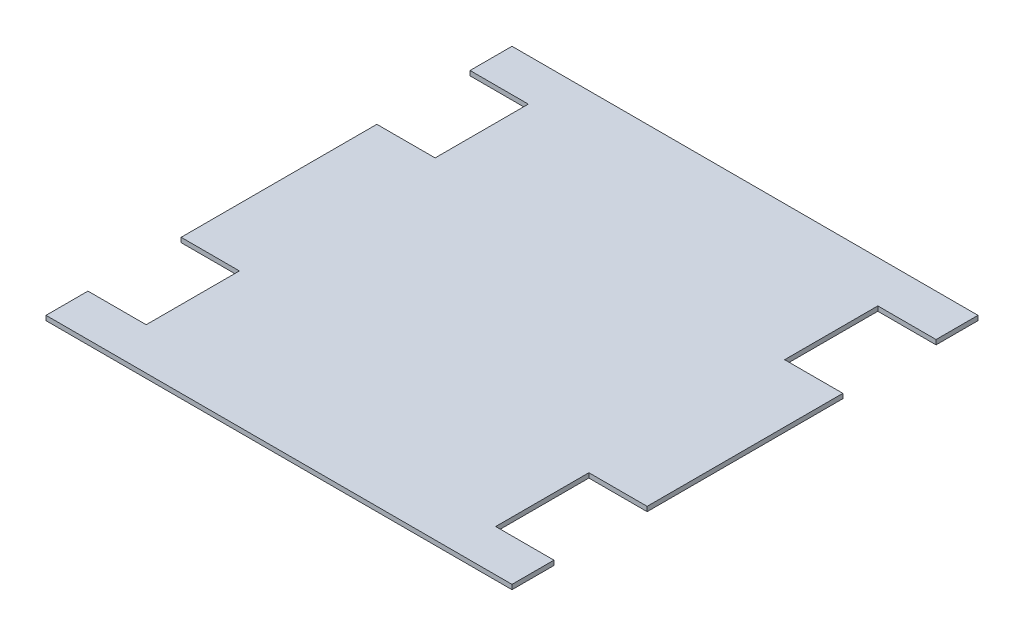
ISO-10303-21;
HEADER;
FILE_DESCRIPTION(('STEP AP214'),'2;1');
FILE_NAME('part.step','',(''),(''),'','','');
FILE_SCHEMA(('AUTOMOTIVE_DESIGN { 1 0 10303 214 1 1 1 1 }'));
ENDSEC;
DATA;
#1=APPLICATION_CONTEXT('core data for automotive mechanical design processes');
#2=APPLICATION_PROTOCOL_DEFINITION('international standard','automotive_design',2000,#1);
#3=PRODUCT_CONTEXT('',#1,'mechanical');
#4=PRODUCT('Part','Part','',(#3));
#5=PRODUCT_RELATED_PRODUCT_CATEGORY('part','',(#4));
#6=PRODUCT_DEFINITION_FORMATION('','',#4);
#7=PRODUCT_DEFINITION_CONTEXT('part definition',#1,'design');
#8=PRODUCT_DEFINITION('design','',#6,#7);
#9=PRODUCT_DEFINITION_SHAPE('','',#8);
#10=(LENGTH_UNIT() NAMED_UNIT(*) SI_UNIT(.MILLI.,.METRE.));
#11=(NAMED_UNIT(*) PLANE_ANGLE_UNIT() SI_UNIT($,.RADIAN.));
#12=(NAMED_UNIT(*) SI_UNIT($,.STERADIAN.) SOLID_ANGLE_UNIT());
#13=UNCERTAINTY_MEASURE_WITH_UNIT(LENGTH_MEASURE(1.E-05),#10,'distance_accuracy_value','');
#14=(GEOMETRIC_REPRESENTATION_CONTEXT(3) GLOBAL_UNCERTAINTY_ASSIGNED_CONTEXT((#13)) GLOBAL_UNIT_ASSIGNED_CONTEXT((#10,
#11,#12)) REPRESENTATION_CONTEXT('',''));
#15=CARTESIAN_POINT('',(0.,0.,0.));
#16=DIRECTION('',(0.,0.,1.));
#17=DIRECTION('',(1.,0.,0.));
#18=AXIS2_PLACEMENT_3D('',#15,#16,#17);
#19=CARTESIAN_POINT('',(250.,5.,-250.));
#20=DIRECTION('',(-1.,0.,0.));
#21=DIRECTION('',(0.,0.,1.));
#22=AXIS2_PLACEMENT_3D('',#19,#20,#21);
#23=PLANE('',#22);
#24=DIRECTION('',(0.,1.,0.));
#25=VECTOR('',#24,1.);
#26=CARTESIAN_POINT('',(250.,0.,-205.));
#27=LINE('',#26,#25);
#28=CARTESIAN_POINT('',(250.,0.,-205.));
#29=VERTEX_POINT('',#28);
#30=CARTESIAN_POINT('',(250.,5.,-205.));
#31=VERTEX_POINT('',#30);
#32=EDGE_CURVE('E252',#29,#31,#27,.T.);
#33=ORIENTED_EDGE('',*,*,#32,.F.);
#34=DIRECTION('',(0.,0.,-1.));
#35=VECTOR('',#34,1.);
#36=CARTESIAN_POINT('',(250.,0.,-250.));
#37=LINE('',#36,#35);
#38=CARTESIAN_POINT('',(250.,0.,-250.));
#39=VERTEX_POINT('',#38);
#40=EDGE_CURVE('E276',#29,#39,#37,.T.);
#41=ORIENTED_EDGE('',*,*,#40,.T.);
#42=DIRECTION('',(0.,-1.,0.));
#43=VECTOR('',#42,1.);
#44=CARTESIAN_POINT('',(250.,5.,-250.));
#45=LINE('',#44,#43);
#46=CARTESIAN_POINT('',(250.,5.,-250.));
#47=VERTEX_POINT('',#46);
#48=EDGE_CURVE('E11',#47,#39,#45,.T.);
#49=ORIENTED_EDGE('',*,*,#48,.F.);
#50=DIRECTION('',(0.,0.,-1.));
#51=VECTOR('',#50,1.);
#52=CARTESIAN_POINT('',(250.,5.,-250.));
#53=LINE('',#52,#51);
#54=EDGE_CURVE('E286',#31,#47,#53,.T.);
#55=ORIENTED_EDGE('',*,*,#54,.F.);
#56=EDGE_LOOP('',(#33,#41,#49,#55));
#57=FACE_BOUND('',#56,.T.);
#58=ADVANCED_FACE('F36',(#57),#23,.F.);
#59=CARTESIAN_POINT('',(250.,0.,105.));
#60=VERTEX_POINT('',#59);
#61=CARTESIAN_POINT('',(250.,0.,-105.));
#62=VERTEX_POINT('',#61);
#63=EDGE_CURVE('E300',#60,#62,#37,.T.);
#64=ORIENTED_EDGE('',*,*,#63,.T.);
#65=DIRECTION('',(0.,1.,0.));
#66=VECTOR('',#65,1.);
#67=CARTESIAN_POINT('',(250.,0.,-105.));
#68=LINE('',#67,#66);
#69=CARTESIAN_POINT('',(250.,5.,-105.));
#70=VERTEX_POINT('',#69);
#71=EDGE_CURVE('E254',#62,#70,#68,.T.);
#72=ORIENTED_EDGE('',*,*,#71,.T.);
#73=CARTESIAN_POINT('',(250.,5.,105.));
#74=VERTEX_POINT('',#73);
#75=EDGE_CURVE('E285',#74,#70,#53,.T.);
#76=ORIENTED_EDGE('',*,*,#75,.F.);
#77=DIRECTION('',(0.,1.,0.));
#78=VECTOR('',#77,1.);
#79=CARTESIAN_POINT('',(250.,0.,105.));
#80=LINE('',#79,#78);
#81=EDGE_CURVE('E228',#60,#74,#80,.T.);
#82=ORIENTED_EDGE('',*,*,#81,.F.);
#83=EDGE_LOOP('',(#64,#72,#76,#82));
#84=FACE_BOUND('',#83,.T.);
#85=ADVANCED_FACE('F343',(#84),#23,.F.);
#86=CARTESIAN_POINT('',(-250.,5.,-250.));
#87=DIRECTION('',(1.,0.,0.));
#88=DIRECTION('',(0.,0.,-1.));
#89=AXIS2_PLACEMENT_3D('',#86,#87,#88);
#90=PLANE('',#89);
#91=DIRECTION('',(0.,1.,0.));
#92=VECTOR('',#91,1.);
#93=CARTESIAN_POINT('',(-250.,0.,105.));
#94=LINE('',#93,#92);
#95=CARTESIAN_POINT('',(-250.,0.,105.));
#96=VERTEX_POINT('',#95);
#97=CARTESIAN_POINT('',(-250.,5.,105.));
#98=VERTEX_POINT('',#97);
#99=EDGE_CURVE('E51',#96,#98,#94,.T.);
#100=ORIENTED_EDGE('',*,*,#99,.T.);
#101=DIRECTION('',(0.,0.,1.));
#102=VECTOR('',#101,1.);
#103=CARTESIAN_POINT('',(-250.,5.,-250.));
#104=LINE('',#103,#102);
#105=CARTESIAN_POINT('',(-250.,5.,-105.));
#106=VERTEX_POINT('',#105);
#107=EDGE_CURVE('E293',#106,#98,#104,.T.);
#108=ORIENTED_EDGE('',*,*,#107,.F.);
#109=DIRECTION('',(0.,1.,0.));
#110=VECTOR('',#109,1.);
#111=CARTESIAN_POINT('',(-250.,0.,-105.));
#112=LINE('',#111,#110);
#113=CARTESIAN_POINT('',(-250.,0.,-105.));
#114=VERTEX_POINT('',#113);
#115=EDGE_CURVE('E277',#114,#106,#112,.T.);
#116=ORIENTED_EDGE('',*,*,#115,.F.);
#117=DIRECTION('',(0.,0.,1.));
#118=VECTOR('',#117,1.);
#119=CARTESIAN_POINT('',(-250.,0.,-250.));
#120=LINE('',#119,#118);
#121=EDGE_CURVE('E307',#114,#96,#120,.T.);
#122=ORIENTED_EDGE('',*,*,#121,.T.);
#123=EDGE_LOOP('',(#100,#108,#116,#122));
#124=FACE_BOUND('',#123,.T.);
#125=ADVANCED_FACE('F375',(#124),#90,.F.);
#126=DIRECTION('',(0.,1.,0.));
#127=VECTOR('',#126,1.);
#128=CARTESIAN_POINT('',(-250.,0.,-205.));
#129=LINE('',#128,#127);
#130=CARTESIAN_POINT('',(-250.,0.,-205.));
#131=VERTEX_POINT('',#130);
#132=CARTESIAN_POINT('',(-250.,5.,-205.));
#133=VERTEX_POINT('',#132);
#134=EDGE_CURVE('E59',#131,#133,#129,.T.);
#135=ORIENTED_EDGE('',*,*,#134,.T.);
#136=CARTESIAN_POINT('',(-250.,5.,-250.));
#137=VERTEX_POINT('',#136);
#138=EDGE_CURVE('E289',#137,#133,#104,.T.);
#139=ORIENTED_EDGE('',*,*,#138,.F.);
#140=DIRECTION('',(0.,-1.,0.));
#141=VECTOR('',#140,1.);
#142=CARTESIAN_POINT('',(-250.,5.,-250.));
#143=LINE('',#142,#141);
#144=CARTESIAN_POINT('',(-250.,0.,-250.));
#145=VERTEX_POINT('',#144);
#146=EDGE_CURVE('E44',#137,#145,#143,.T.);
#147=ORIENTED_EDGE('',*,*,#146,.T.);
#148=EDGE_CURVE('E303',#145,#131,#120,.T.);
#149=ORIENTED_EDGE('',*,*,#148,.T.);
#150=EDGE_LOOP('',(#135,#139,#147,#149));
#151=FACE_BOUND('',#150,.T.);
#152=ADVANCED_FACE('F318',(#151),#90,.F.);
#153=CARTESIAN_POINT('',(0.,5.,0.));
#154=DIRECTION('',(0.,1.,0.));
#155=DIRECTION('',(0.,0.,1.));
#156=AXIS2_PLACEMENT_3D('',#153,#154,#155);
#157=PLANE('',#156);
#158=DIRECTION('',(0.,0.,1.));
#159=VECTOR('',#158,1.);
#160=CARTESIAN_POINT('',(187.5,5.,0.));
#161=LINE('',#160,#159);
#162=CARTESIAN_POINT('',(187.5,5.,-205.));
#163=VERTEX_POINT('',#162);
#164=CARTESIAN_POINT('',(187.5,5.,-105.));
#165=VERTEX_POINT('',#164);
#166=EDGE_CURVE('E244',#163,#165,#161,.T.);
#167=ORIENTED_EDGE('',*,*,#166,.F.);
#168=DIRECTION('',(1.,0.,0.));
#169=VECTOR('',#168,1.);
#170=CARTESIAN_POINT('',(0.,5.,-205.));
#171=LINE('',#170,#169);
#172=EDGE_CURVE('E238',#163,#31,#171,.T.);
#173=ORIENTED_EDGE('',*,*,#172,.T.);
#174=ORIENTED_EDGE('',*,*,#54,.T.);
#175=DIRECTION('',(-1.,0.,0.));
#176=VECTOR('',#175,1.);
#177=CARTESIAN_POINT('',(-250.,5.,-250.));
#178=LINE('',#177,#176);
#179=EDGE_CURVE('E284',#47,#137,#178,.T.);
#180=ORIENTED_EDGE('',*,*,#179,.T.);
#181=ORIENTED_EDGE('',*,*,#138,.T.);
#182=DIRECTION('',(1.,0.,0.));
#183=VECTOR('',#182,1.);
#184=CARTESIAN_POINT('',(0.,5.,-205.));
#185=LINE('',#184,#183);
#186=CARTESIAN_POINT('',(-187.5,5.,-205.));
#187=VERTEX_POINT('',#186);
#188=EDGE_CURVE('E269',#133,#187,#185,.T.);
#189=ORIENTED_EDGE('',*,*,#188,.T.);
#190=DIRECTION('',(0.,0.,1.));
#191=VECTOR('',#190,1.);
#192=CARTESIAN_POINT('',(-187.5,5.,0.));
#193=LINE('',#192,#191);
#194=CARTESIAN_POINT('',(-187.5,5.,-105.));
#195=VERTEX_POINT('',#194);
#196=EDGE_CURVE('E205',#187,#195,#193,.T.);
#197=ORIENTED_EDGE('',*,*,#196,.T.);
#198=DIRECTION('',(1.,0.,0.));
#199=VECTOR('',#198,1.);
#200=CARTESIAN_POINT('',(0.,5.,-105.));
#201=LINE('',#200,#199);
#202=EDGE_CURVE('E261',#106,#195,#201,.T.);
#203=ORIENTED_EDGE('',*,*,#202,.F.);
#204=ORIENTED_EDGE('',*,*,#107,.T.);
#205=DIRECTION('',(1.,0.,0.));
#206=VECTOR('',#205,1.);
#207=CARTESIAN_POINT('',(0.,5.,105.));
#208=LINE('',#207,#206);
#209=CARTESIAN_POINT('',(-187.5,5.,105.));
#210=VERTEX_POINT('',#209);
#211=EDGE_CURVE('E196',#98,#210,#208,.T.);
#212=ORIENTED_EDGE('',*,*,#211,.T.);
#213=DIRECTION('',(0.,0.,1.));
#214=VECTOR('',#213,1.);
#215=CARTESIAN_POINT('',(-187.5,5.,0.));
#216=LINE('',#215,#214);
#217=CARTESIAN_POINT('',(-187.5,5.,205.));
#218=VERTEX_POINT('',#217);
#219=EDGE_CURVE('E186',#210,#218,#216,.T.);
#220=ORIENTED_EDGE('',*,*,#219,.T.);
#221=DIRECTION('',(1.,0.,0.));
#222=VECTOR('',#221,1.);
#223=CARTESIAN_POINT('',(0.,5.,205.));
#224=LINE('',#223,#222);
#225=CARTESIAN_POINT('',(-250.,5.,205.));
#226=VERTEX_POINT('',#225);
#227=EDGE_CURVE('E193',#226,#218,#224,.T.);
#228=ORIENTED_EDGE('',*,*,#227,.F.);
#229=CARTESIAN_POINT('',(-250.,5.,250.));
#230=VERTEX_POINT('',#229);
#231=EDGE_CURVE('E288',#226,#230,#104,.T.);
#232=ORIENTED_EDGE('',*,*,#231,.T.);
#233=DIRECTION('',(1.,0.,0.));
#234=VECTOR('',#233,1.);
#235=CARTESIAN_POINT('',(-250.,5.,250.));
#236=LINE('',#235,#234);
#237=CARTESIAN_POINT('',(250.,5.,250.));
#238=VERTEX_POINT('',#237);
#239=EDGE_CURVE('E292',#230,#238,#236,.T.);
#240=ORIENTED_EDGE('',*,*,#239,.T.);
#241=CARTESIAN_POINT('',(250.,5.,205.));
#242=VERTEX_POINT('',#241);
#243=EDGE_CURVE('E281',#238,#242,#53,.T.);
#244=ORIENTED_EDGE('',*,*,#243,.T.);
#245=DIRECTION('',(1.,0.,0.));
#246=VECTOR('',#245,1.);
#247=CARTESIAN_POINT('',(0.,5.,205.));
#248=LINE('',#247,#246);
#249=CARTESIAN_POINT('',(187.5,5.,205.));
#250=VERTEX_POINT('',#249);
#251=EDGE_CURVE('E222',#250,#242,#248,.T.);
#252=ORIENTED_EDGE('',*,*,#251,.F.);
#253=DIRECTION('',(0.,0.,1.));
#254=VECTOR('',#253,1.);
#255=CARTESIAN_POINT('',(187.5,5.,0.));
#256=LINE('',#255,#254);
#257=CARTESIAN_POINT('',(187.5,5.,105.));
#258=VERTEX_POINT('',#257);
#259=EDGE_CURVE('E219',#258,#250,#256,.T.);
#260=ORIENTED_EDGE('',*,*,#259,.F.);
#261=DIRECTION('',(1.,0.,0.));
#262=VECTOR('',#261,1.);
#263=CARTESIAN_POINT('',(0.,5.,105.));
#264=LINE('',#263,#262);
#265=EDGE_CURVE('E213',#258,#74,#264,.T.);
#266=ORIENTED_EDGE('',*,*,#265,.T.);
#267=ORIENTED_EDGE('',*,*,#75,.T.);
#268=DIRECTION('',(1.,0.,0.));
#269=VECTOR('',#268,1.);
#270=CARTESIAN_POINT('',(0.,5.,-105.));
#271=LINE('',#270,#269);
#272=EDGE_CURVE('E247',#165,#70,#271,.T.);
#273=ORIENTED_EDGE('',*,*,#272,.F.);
#274=EDGE_LOOP('',(#167,#173,#174,#180,#181,#189,#197,#203,#204,#212,#220,#228,#232,#240,#244,
#252,#260,#266,#267,#273));
#275=FACE_BOUND('',#274,.T.);
#276=ADVANCED_FACE('F333',(#275),#157,.T.);
#277=CARTESIAN_POINT('',(0.,0.,0.));
#278=DIRECTION('',(0.,1.,0.));
#279=DIRECTION('',(0.,0.,1.));
#280=AXIS2_PLACEMENT_3D('',#277,#278,#279);
#281=PLANE('',#280);
#282=DIRECTION('',(1.,0.,0.));
#283=VECTOR('',#282,1.);
#284=CARTESIAN_POINT('',(0.,0.,-205.));
#285=LINE('',#284,#283);
#286=CARTESIAN_POINT('',(187.5,0.,-205.));
#287=VERTEX_POINT('',#286);
#288=EDGE_CURVE('E241',#287,#29,#285,.T.);
#289=ORIENTED_EDGE('',*,*,#288,.F.);
#290=DIRECTION('',(0.,0.,1.));
#291=VECTOR('',#290,1.);
#292=CARTESIAN_POINT('',(187.5,0.,0.));
#293=LINE('',#292,#291);
#294=CARTESIAN_POINT('',(187.5,0.,-105.));
#295=VERTEX_POINT('',#294);
#296=EDGE_CURVE('E234',#287,#295,#293,.T.);
#297=ORIENTED_EDGE('',*,*,#296,.T.);
#298=DIRECTION('',(1.,0.,0.));
#299=VECTOR('',#298,1.);
#300=CARTESIAN_POINT('',(0.,0.,-105.));
#301=LINE('',#300,#299);
#302=EDGE_CURVE('E237',#295,#62,#301,.T.);
#303=ORIENTED_EDGE('',*,*,#302,.T.);
#304=ORIENTED_EDGE('',*,*,#63,.F.);
#305=DIRECTION('',(1.,0.,0.));
#306=VECTOR('',#305,1.);
#307=CARTESIAN_POINT('',(0.,0.,105.));
#308=LINE('',#307,#306);
#309=CARTESIAN_POINT('',(187.5,0.,105.));
#310=VERTEX_POINT('',#309);
#311=EDGE_CURVE('E216',#310,#60,#308,.T.);
#312=ORIENTED_EDGE('',*,*,#311,.F.);
#313=DIRECTION('',(0.,0.,1.));
#314=VECTOR('',#313,1.);
#315=CARTESIAN_POINT('',(187.5,0.,0.));
#316=LINE('',#315,#314);
#317=CARTESIAN_POINT('',(187.5,0.,205.));
#318=VERTEX_POINT('',#317);
#319=EDGE_CURVE('E209',#310,#318,#316,.T.);
#320=ORIENTED_EDGE('',*,*,#319,.T.);
#321=DIRECTION('',(1.,0.,0.));
#322=VECTOR('',#321,1.);
#323=CARTESIAN_POINT('',(0.,0.,205.));
#324=LINE('',#323,#322);
#325=CARTESIAN_POINT('',(250.,0.,205.));
#326=VERTEX_POINT('',#325);
#327=EDGE_CURVE('E212',#318,#326,#324,.T.);
#328=ORIENTED_EDGE('',*,*,#327,.T.);
#329=CARTESIAN_POINT('',(250.,0.,250.));
#330=VERTEX_POINT('',#329);
#331=EDGE_CURVE('E296',#330,#326,#37,.T.);
#332=ORIENTED_EDGE('',*,*,#331,.F.);
#333=DIRECTION('',(1.,0.,0.));
#334=VECTOR('',#333,1.);
#335=CARTESIAN_POINT('',(-250.,0.,250.));
#336=LINE('',#335,#334);
#337=CARTESIAN_POINT('',(-250.,0.,250.));
#338=VERTEX_POINT('',#337);
#339=EDGE_CURVE('E306',#338,#330,#336,.T.);
#340=ORIENTED_EDGE('',*,*,#339,.F.);
#341=CARTESIAN_POINT('',(-250.,0.,205.));
#342=VERTEX_POINT('',#341);
#343=EDGE_CURVE('E302',#342,#338,#120,.T.);
#344=ORIENTED_EDGE('',*,*,#343,.F.);
#345=DIRECTION('',(1.,0.,0.));
#346=VECTOR('',#345,1.);
#347=CARTESIAN_POINT('',(0.,0.,205.));
#348=LINE('',#347,#346);
#349=CARTESIAN_POINT('',(-187.5,0.,205.));
#350=VERTEX_POINT('',#349);
#351=EDGE_CURVE('E179',#342,#350,#348,.T.);
#352=ORIENTED_EDGE('',*,*,#351,.T.);
#353=DIRECTION('',(0.,0.,1.));
#354=VECTOR('',#353,1.);
#355=CARTESIAN_POINT('',(-187.5,0.,0.));
#356=LINE('',#355,#354);
#357=CARTESIAN_POINT('',(-187.5,0.,105.));
#358=VERTEX_POINT('',#357);
#359=EDGE_CURVE('E180',#358,#350,#356,.T.);
#360=ORIENTED_EDGE('',*,*,#359,.F.);
#361=DIRECTION('',(1.,0.,0.));
#362=VECTOR('',#361,1.);
#363=CARTESIAN_POINT('',(0.,0.,105.));
#364=LINE('',#363,#362);
#365=EDGE_CURVE('E170',#96,#358,#364,.T.);
#366=ORIENTED_EDGE('',*,*,#365,.F.);
#367=ORIENTED_EDGE('',*,*,#121,.F.);
#368=DIRECTION('',(1.,0.,0.));
#369=VECTOR('',#368,1.);
#370=CARTESIAN_POINT('',(0.,0.,-105.));
#371=LINE('',#370,#369);
#372=CARTESIAN_POINT('',(-187.5,0.,-105.));
#373=VERTEX_POINT('',#372);
#374=EDGE_CURVE('E263',#114,#373,#371,.T.);
#375=ORIENTED_EDGE('',*,*,#374,.T.);
#376=DIRECTION('',(0.,0.,1.));
#377=VECTOR('',#376,1.);
#378=CARTESIAN_POINT('',(-187.5,0.,0.));
#379=LINE('',#378,#377);
#380=CARTESIAN_POINT('',(-187.5,0.,-205.));
#381=VERTEX_POINT('',#380);
#382=EDGE_CURVE('E258',#381,#373,#379,.T.);
#383=ORIENTED_EDGE('',*,*,#382,.F.);
#384=DIRECTION('',(1.,0.,0.));
#385=VECTOR('',#384,1.);
#386=CARTESIAN_POINT('',(0.,0.,-205.));
#387=LINE('',#386,#385);
#388=EDGE_CURVE('E260',#131,#381,#387,.T.);
#389=ORIENTED_EDGE('',*,*,#388,.F.);
#390=ORIENTED_EDGE('',*,*,#148,.F.);
#391=DIRECTION('',(-1.,0.,0.));
#392=VECTOR('',#391,1.);
#393=CARTESIAN_POINT('',(-250.,0.,-250.));
#394=LINE('',#393,#392);
#395=EDGE_CURVE('E299',#39,#145,#394,.T.);
#396=ORIENTED_EDGE('',*,*,#395,.F.);
#397=ORIENTED_EDGE('',*,*,#40,.F.);
#398=EDGE_LOOP('',(#289,#297,#303,#304,#312,#320,#328,#332,#340,#344,#352,#360,#366,#367,#375,
#383,#389,#390,#396,#397));
#399=FACE_BOUND('',#398,.T.);
#400=ADVANCED_FACE('F191',(#399),#281,.F.);
#401=ORIENTED_EDGE('',*,*,#331,.T.);
#402=DIRECTION('',(0.,1.,0.));
#403=VECTOR('',#402,1.);
#404=CARTESIAN_POINT('',(250.,0.,205.));
#405=LINE('',#404,#403);
#406=EDGE_CURVE('E230',#326,#242,#405,.T.);
#407=ORIENTED_EDGE('',*,*,#406,.T.);
#408=ORIENTED_EDGE('',*,*,#243,.F.);
#409=DIRECTION('',(0.,-1.,0.));
#410=VECTOR('',#409,1.);
#411=CARTESIAN_POINT('',(250.,5.,250.));
#412=LINE('',#411,#410);
#413=EDGE_CURVE('E295',#238,#330,#412,.T.);
#414=ORIENTED_EDGE('',*,*,#413,.T.);
#415=EDGE_LOOP('',(#401,#407,#408,#414));
#416=FACE_BOUND('',#415,.T.);
#417=ADVANCED_FACE('F38',(#416),#23,.F.);
#418=CARTESIAN_POINT('',(-250.,5.,-250.));
#419=DIRECTION('',(0.,0.,1.));
#420=DIRECTION('',(1.,0.,0.));
#421=AXIS2_PLACEMENT_3D('',#418,#419,#420);
#422=PLANE('',#421);
#423=ORIENTED_EDGE('',*,*,#395,.T.);
#424=ORIENTED_EDGE('',*,*,#146,.F.);
#425=ORIENTED_EDGE('',*,*,#179,.F.);
#426=ORIENTED_EDGE('',*,*,#48,.T.);
#427=EDGE_LOOP('',(#423,#424,#425,#426));
#428=FACE_BOUND('',#427,.T.);
#429=ADVANCED_FACE('F336',(#428),#422,.F.);
#430=ORIENTED_EDGE('',*,*,#231,.F.);
#431=DIRECTION('',(0.,1.,0.));
#432=VECTOR('',#431,1.);
#433=CARTESIAN_POINT('',(-250.,0.,205.));
#434=LINE('',#433,#432);
#435=EDGE_CURVE('E206',#342,#226,#434,.T.);
#436=ORIENTED_EDGE('',*,*,#435,.F.);
#437=ORIENTED_EDGE('',*,*,#343,.T.);
#438=DIRECTION('',(0.,-1.,0.));
#439=VECTOR('',#438,1.);
#440=CARTESIAN_POINT('',(-250.,5.,250.));
#441=LINE('',#440,#439);
#442=EDGE_CURVE('E311',#230,#338,#441,.T.);
#443=ORIENTED_EDGE('',*,*,#442,.F.);
#444=EDGE_LOOP('',(#430,#436,#437,#443));
#445=FACE_BOUND('',#444,.T.);
#446=ADVANCED_FACE('F382',(#445),#90,.F.);
#447=CARTESIAN_POINT('',(-250.,5.,250.));
#448=DIRECTION('',(0.,0.,-1.));
#449=DIRECTION('',(-1.,0.,0.));
#450=AXIS2_PLACEMENT_3D('',#447,#448,#449);
#451=PLANE('',#450);
#452=ORIENTED_EDGE('',*,*,#339,.T.);
#453=ORIENTED_EDGE('',*,*,#413,.F.);
#454=ORIENTED_EDGE('',*,*,#239,.F.);
#455=ORIENTED_EDGE('',*,*,#442,.T.);
#456=EDGE_LOOP('',(#452,#453,#454,#455));
#457=FACE_BOUND('',#456,.T.);
#458=ADVANCED_FACE('F369',(#457),#451,.F.);
#459=CARTESIAN_POINT('',(-187.5,0.,0.));
#460=DIRECTION('',(-1.,0.,0.));
#461=DIRECTION('',(0.,0.,1.));
#462=AXIS2_PLACEMENT_3D('',#459,#460,#461);
#463=PLANE('',#462);
#464=ORIENTED_EDGE('',*,*,#196,.F.);
#465=DIRECTION('',(0.,1.,0.));
#466=VECTOR('',#465,1.);
#467=CARTESIAN_POINT('',(-187.5,0.,-205.));
#468=LINE('',#467,#466);
#469=EDGE_CURVE('E266',#381,#187,#468,.T.);
#470=ORIENTED_EDGE('',*,*,#469,.F.);
#471=ORIENTED_EDGE('',*,*,#382,.T.);
#472=DIRECTION('',(0.,1.,0.));
#473=VECTOR('',#472,1.);
#474=CARTESIAN_POINT('',(-187.5,0.,-105.));
#475=LINE('',#474,#473);
#476=EDGE_CURVE('E274',#373,#195,#475,.T.);
#477=ORIENTED_EDGE('',*,*,#476,.T.);
#478=EDGE_LOOP('',(#464,#470,#471,#477));
#479=FACE_BOUND('',#478,.T.);
#480=ADVANCED_FACE('F328',(#479),#463,.T.);
#481=CARTESIAN_POINT('',(0.,0.,-105.));
#482=DIRECTION('',(0.,0.,1.));
#483=DIRECTION('',(1.,0.,0.));
#484=AXIS2_PLACEMENT_3D('',#481,#482,#483);
#485=PLANE('',#484);
#486=ORIENTED_EDGE('',*,*,#202,.T.);
#487=ORIENTED_EDGE('',*,*,#476,.F.);
#488=ORIENTED_EDGE('',*,*,#374,.F.);
#489=ORIENTED_EDGE('',*,*,#115,.T.);
#490=EDGE_LOOP('',(#486,#487,#488,#489));
#491=FACE_BOUND('',#490,.T.);
#492=ADVANCED_FACE('F379',(#491),#485,.F.);
#493=CARTESIAN_POINT('',(0.,0.,-205.));
#494=DIRECTION('',(0.,0.,1.));
#495=DIRECTION('',(1.,0.,0.));
#496=AXIS2_PLACEMENT_3D('',#493,#494,#495);
#497=PLANE('',#496);
#498=ORIENTED_EDGE('',*,*,#188,.F.);
#499=ORIENTED_EDGE('',*,*,#134,.F.);
#500=ORIENTED_EDGE('',*,*,#388,.T.);
#501=ORIENTED_EDGE('',*,*,#469,.T.);
#502=EDGE_LOOP('',(#498,#499,#500,#501));
#503=FACE_BOUND('',#502,.T.);
#504=ADVANCED_FACE('F325',(#503),#497,.T.);
#505=CARTESIAN_POINT('',(-187.5,0.,0.));
#506=DIRECTION('',(-1.,0.,0.));
#507=DIRECTION('',(0.,0.,1.));
#508=AXIS2_PLACEMENT_3D('',#505,#506,#507);
#509=PLANE('',#508);
#510=ORIENTED_EDGE('',*,*,#219,.F.);
#511=DIRECTION('',(0.,1.,0.));
#512=VECTOR('',#511,1.);
#513=CARTESIAN_POINT('',(-187.5,0.,105.));
#514=LINE('',#513,#512);
#515=EDGE_CURVE('E173',#358,#210,#514,.T.);
#516=ORIENTED_EDGE('',*,*,#515,.F.);
#517=ORIENTED_EDGE('',*,*,#359,.T.);
#518=DIRECTION('',(0.,1.,0.));
#519=VECTOR('',#518,1.);
#520=CARTESIAN_POINT('',(-187.5,0.,205.));
#521=LINE('',#520,#519);
#522=EDGE_CURVE('E203',#350,#218,#521,.T.);
#523=ORIENTED_EDGE('',*,*,#522,.T.);
#524=EDGE_LOOP('',(#510,#516,#517,#523));
#525=FACE_BOUND('',#524,.T.);
#526=ADVANCED_FACE('F183',(#525),#509,.T.);
#527=CARTESIAN_POINT('',(0.,0.,205.));
#528=DIRECTION('',(0.,0.,1.));
#529=DIRECTION('',(1.,0.,0.));
#530=AXIS2_PLACEMENT_3D('',#527,#528,#529);
#531=PLANE('',#530);
#532=ORIENTED_EDGE('',*,*,#227,.T.);
#533=ORIENTED_EDGE('',*,*,#522,.F.);
#534=ORIENTED_EDGE('',*,*,#351,.F.);
#535=ORIENTED_EDGE('',*,*,#435,.T.);
#536=EDGE_LOOP('',(#532,#533,#534,#535));
#537=FACE_BOUND('',#536,.T.);
#538=ADVANCED_FACE('F431',(#537),#531,.F.);
#539=CARTESIAN_POINT('',(0.,0.,105.));
#540=DIRECTION('',(0.,0.,1.));
#541=DIRECTION('',(1.,0.,0.));
#542=AXIS2_PLACEMENT_3D('',#539,#540,#541);
#543=PLANE('',#542);
#544=ORIENTED_EDGE('',*,*,#211,.F.);
#545=ORIENTED_EDGE('',*,*,#99,.F.);
#546=ORIENTED_EDGE('',*,*,#365,.T.);
#547=ORIENTED_EDGE('',*,*,#515,.T.);
#548=EDGE_LOOP('',(#544,#545,#546,#547));
#549=FACE_BOUND('',#548,.T.);
#550=ADVANCED_FACE('F172',(#549),#543,.T.);
#551=CARTESIAN_POINT('',(187.5,0.,0.));
#552=DIRECTION('',(-1.,0.,0.));
#553=DIRECTION('',(0.,0.,1.));
#554=AXIS2_PLACEMENT_3D('',#551,#552,#553);
#555=PLANE('',#554);
#556=ORIENTED_EDGE('',*,*,#259,.T.);
#557=DIRECTION('',(0.,1.,0.));
#558=VECTOR('',#557,1.);
#559=CARTESIAN_POINT('',(187.5,0.,205.));
#560=LINE('',#559,#558);
#561=EDGE_CURVE('E218',#318,#250,#560,.T.);
#562=ORIENTED_EDGE('',*,*,#561,.F.);
#563=ORIENTED_EDGE('',*,*,#319,.F.);
#564=DIRECTION('',(0.,1.,0.));
#565=VECTOR('',#564,1.);
#566=CARTESIAN_POINT('',(187.5,0.,105.));
#567=LINE('',#566,#565);
#568=EDGE_CURVE('E201',#310,#258,#567,.T.);
#569=ORIENTED_EDGE('',*,*,#568,.T.);
#570=EDGE_LOOP('',(#556,#562,#563,#569));
#571=FACE_BOUND('',#570,.T.);
#572=ADVANCED_FACE('F359',(#571),#555,.F.);
#573=CARTESIAN_POINT('',(0.,0.,105.));
#574=DIRECTION('',(0.,0.,1.));
#575=DIRECTION('',(1.,0.,0.));
#576=AXIS2_PLACEMENT_3D('',#573,#574,#575);
#577=PLANE('',#576);
#578=ORIENTED_EDGE('',*,*,#265,.F.);
#579=ORIENTED_EDGE('',*,*,#568,.F.);
#580=ORIENTED_EDGE('',*,*,#311,.T.);
#581=ORIENTED_EDGE('',*,*,#81,.T.);
#582=EDGE_LOOP('',(#578,#579,#580,#581));
#583=FACE_BOUND('',#582,.T.);
#584=ADVANCED_FACE('F356',(#583),#577,.T.);
#585=CARTESIAN_POINT('',(0.,0.,205.));
#586=DIRECTION('',(0.,0.,1.));
#587=DIRECTION('',(1.,0.,0.));
#588=AXIS2_PLACEMENT_3D('',#585,#586,#587);
#589=PLANE('',#588);
#590=ORIENTED_EDGE('',*,*,#251,.T.);
#591=ORIENTED_EDGE('',*,*,#406,.F.);
#592=ORIENTED_EDGE('',*,*,#327,.F.);
#593=ORIENTED_EDGE('',*,*,#561,.T.);
#594=EDGE_LOOP('',(#590,#591,#592,#593));
#595=FACE_BOUND('',#594,.T.);
#596=ADVANCED_FACE('F416',(#595),#589,.F.);
#597=CARTESIAN_POINT('',(187.5,0.,0.));
#598=DIRECTION('',(-1.,0.,0.));
#599=DIRECTION('',(0.,0.,1.));
#600=AXIS2_PLACEMENT_3D('',#597,#598,#599);
#601=PLANE('',#600);
#602=ORIENTED_EDGE('',*,*,#166,.T.);
#603=DIRECTION('',(0.,1.,0.));
#604=VECTOR('',#603,1.);
#605=CARTESIAN_POINT('',(187.5,0.,-105.));
#606=LINE('',#605,#604);
#607=EDGE_CURVE('E243',#295,#165,#606,.T.);
#608=ORIENTED_EDGE('',*,*,#607,.F.);
#609=ORIENTED_EDGE('',*,*,#296,.F.);
#610=DIRECTION('',(0.,1.,0.));
#611=VECTOR('',#610,1.);
#612=CARTESIAN_POINT('',(187.5,0.,-205.));
#613=LINE('',#612,#611);
#614=EDGE_CURVE('E223',#287,#163,#613,.T.);
#615=ORIENTED_EDGE('',*,*,#614,.T.);
#616=EDGE_LOOP('',(#602,#608,#609,#615));
#617=FACE_BOUND('',#616,.T.);
#618=ADVANCED_FACE('F412',(#617),#601,.F.);
#619=CARTESIAN_POINT('',(0.,0.,-205.));
#620=DIRECTION('',(0.,0.,1.));
#621=DIRECTION('',(1.,0.,0.));
#622=AXIS2_PLACEMENT_3D('',#619,#620,#621);
#623=PLANE('',#622);
#624=ORIENTED_EDGE('',*,*,#172,.F.);
#625=ORIENTED_EDGE('',*,*,#614,.F.);
#626=ORIENTED_EDGE('',*,*,#288,.T.);
#627=ORIENTED_EDGE('',*,*,#32,.T.);
#628=EDGE_LOOP('',(#624,#625,#626,#627));
#629=FACE_BOUND('',#628,.T.);
#630=ADVANCED_FACE('F415',(#629),#623,.T.);
#631=CARTESIAN_POINT('',(0.,0.,-105.));
#632=DIRECTION('',(0.,0.,1.));
#633=DIRECTION('',(1.,0.,0.));
#634=AXIS2_PLACEMENT_3D('',#631,#632,#633);
#635=PLANE('',#634);
#636=ORIENTED_EDGE('',*,*,#272,.T.);
#637=ORIENTED_EDGE('',*,*,#71,.F.);
#638=ORIENTED_EDGE('',*,*,#302,.F.);
#639=ORIENTED_EDGE('',*,*,#607,.T.);
#640=EDGE_LOOP('',(#636,#637,#638,#639));
#641=FACE_BOUND('',#640,.T.);
#642=ADVANCED_FACE('F350',(#641),#635,.F.);
#643=CLOSED_SHELL('',(#58,#85,#125,#152,#276,#400,#417,#429,#446,#458,#480,#492,#504,#526,#538,
#550,#572,#584,#596,#618,#630,#642));
#644=MANIFOLD_SOLID_BREP('B2',#643);
#645=ADVANCED_BREP_SHAPE_REPRESENTATION('',(#18,#644),#14);
#646=SHAPE_DEFINITION_REPRESENTATION(#9,#645);
ENDSEC;
END-ISO-10303-21;
